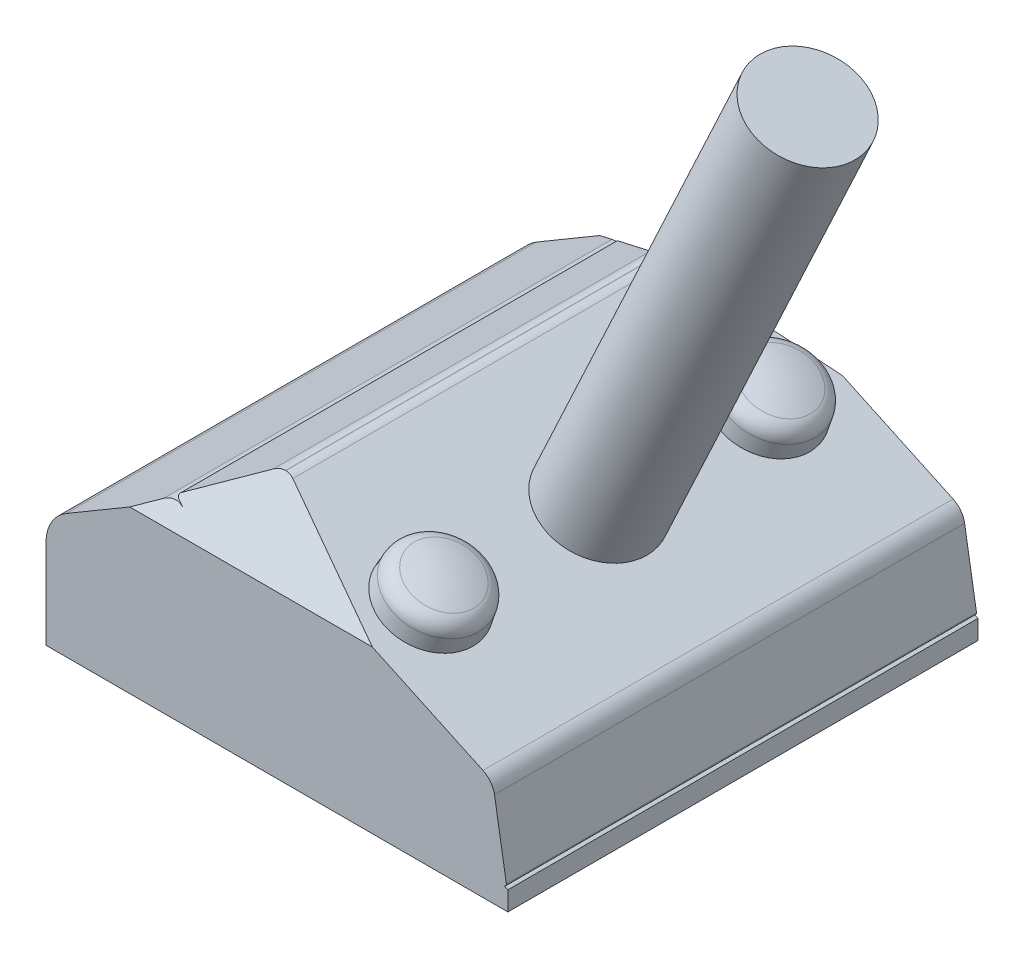
ISO-10303-21;
HEADER;
FILE_DESCRIPTION(('STEP AP214'),'2;1');
FILE_NAME('part.step','',(''),(''),'','','');
FILE_SCHEMA(('AUTOMOTIVE_DESIGN { 1 0 10303 214 1 1 1 1 }'));
ENDSEC;
DATA;
#1=APPLICATION_CONTEXT('core data for automotive mechanical design processes');
#2=APPLICATION_PROTOCOL_DEFINITION('international standard','automotive_design',2000,#1);
#3=PRODUCT_CONTEXT('',#1,'mechanical');
#4=PRODUCT('Part','Part','',(#3));
#5=PRODUCT_RELATED_PRODUCT_CATEGORY('part','',(#4));
#6=PRODUCT_DEFINITION_FORMATION('','',#4);
#7=PRODUCT_DEFINITION_CONTEXT('part definition',#1,'design');
#8=PRODUCT_DEFINITION('design','',#6,#7);
#9=PRODUCT_DEFINITION_SHAPE('','',#8);
#10=(LENGTH_UNIT() NAMED_UNIT(*) SI_UNIT(.MILLI.,.METRE.));
#11=(NAMED_UNIT(*) PLANE_ANGLE_UNIT() SI_UNIT($,.RADIAN.));
#12=(NAMED_UNIT(*) SI_UNIT($,.STERADIAN.) SOLID_ANGLE_UNIT());
#13=UNCERTAINTY_MEASURE_WITH_UNIT(LENGTH_MEASURE(1.E-05),#10,'distance_accuracy_value','');
#14=(GEOMETRIC_REPRESENTATION_CONTEXT(3) GLOBAL_UNCERTAINTY_ASSIGNED_CONTEXT((#13)) GLOBAL_UNIT_ASSIGNED_CONTEXT((#10,
#11,#12)) REPRESENTATION_CONTEXT('',''));
#15=CARTESIAN_POINT('',(0.,0.,0.));
#16=DIRECTION('',(0.,0.,1.));
#17=DIRECTION('',(1.,0.,0.));
#18=AXIS2_PLACEMENT_3D('',#15,#16,#17);
#19=CARTESIAN_POINT('',(-16.8031482844765,7.6682588072031,11.45));
#20=DIRECTION('',(0.,0.,-1.));
#21=DIRECTION('',(-1.,0.,0.));
#22=AXIS2_PLACEMENT_3D('',#19,#20,#21);
#23=CYLINDRICAL_SURFACE('',#22,0.999999999999883);
#24=CARTESIAN_POINT('',(-16.3805246756716,8.5745641008434,10.8930015420235));
#25=CARTESIAN_POINT('',(-16.5107091629722,8.6352710593258,10.8445914876377));
#26=CARTESIAN_POINT('',(-16.6492796784135,8.66825880720299,10.8182857937152));
#27=CARTESIAN_POINT('',(-16.9908686049164,8.66825880720299,10.8182857937152));
#28=CARTESIAN_POINT('',(-17.160420674815,8.61840320334181,10.8580425622092));
#29=CARTESIAN_POINT('',(-17.3106943667089,8.52988342059941,10.9286316281731));
#30=B_SPLINE_CURVE_WITH_KNOTS('',3,(#24,#25,#26,#27,#28,#29),.UNSPECIFIED.,.F.,.F.,(4,2,4),
(5.84684709434019,6.28318530717959,6.81551968798731),.UNSPECIFIED.);
#31=CARTESIAN_POINT('',(-16.380530022736,8.5745665942397,10.8929995536937));
#32=VERTEX_POINT('',#31);
#33=CARTESIAN_POINT('',(-17.310692662731,8.5298844243374,10.9286308277539));
#34=VERTEX_POINT('',#33);
#35=EDGE_CURVE('E159',#32,#34,#30,.T.);
#36=ORIENTED_EDGE('',*,*,#35,.F.);
#37=DIRECTION('',(0.,0.,-1.));
#38=VECTOR('',#37,1.);
#39=CARTESIAN_POINT('',(-16.380530022736,8.5745665942397,10.8929995536937));
#40=LINE('',#39,#38);
#41=CARTESIAN_POINT('',(-16.380530022736,8.57456659423956,-10.8929995536939));
#42=VERTEX_POINT('',#41);
#43=EDGE_CURVE('E148',#32,#42,#40,.T.);
#44=ORIENTED_EDGE('',*,*,#43,.T.);
#45=CARTESIAN_POINT('',(-17.3106943667089,8.52988342059941,-10.9286316281731));
#46=CARTESIAN_POINT('',(-17.160420674815,8.61840320334181,-10.8580425622092));
#47=CARTESIAN_POINT('',(-16.9908685082866,8.66825880720298,-10.8182857937152));
#48=CARTESIAN_POINT('',(-16.6492815491935,8.66825880720298,-10.8182857937152));
#49=CARTESIAN_POINT('',(-16.5107125923549,8.63527185326495,-10.8445908545202));
#50=CARTESIAN_POINT('',(-16.3805292801835,8.5745662479814,-10.8929998298134));
#51=B_SPLINE_CURVE_WITH_KNOTS('',3,(#45,#46,#47,#48,#49,#50),.UNSPECIFIED.,.F.,.F.,(4,2,4),
(2.60925827278207,3.14159265358979,3.57792578590447),.UNSPECIFIED.);
#52=CARTESIAN_POINT('',(-17.310692662731,8.5298844243374,-10.9286308277539));
#53=VERTEX_POINT('',#52);
#54=EDGE_CURVE('E158',#53,#42,#51,.T.);
#55=ORIENTED_EDGE('',*,*,#54,.F.);
#56=DIRECTION('',(0.,0.,-1.));
#57=VECTOR('',#56,1.);
#58=CARTESIAN_POINT('',(-17.310692662731,8.5298844243374,10.9286308277539));
#59=LINE('',#58,#57);
#60=EDGE_CURVE('E175',#34,#53,#59,.T.);
#61=ORIENTED_EDGE('',*,*,#60,.F.);
#62=EDGE_LOOP('',(#36,#44,#55,#61));
#63=FACE_BOUND('',#62,.T.);
#64=ADVANCED_FACE('F16',(#63),#23,.T.);
#65=CARTESIAN_POINT('',(50.,4.5753225075648,14.08215));
#66=DIRECTION('',(0.,0.623473037202736,0.781844851541018));
#67=DIRECTION('',(0.,-0.781844851541018,0.623473037202736));
#68=AXIS2_PLACEMENT_3D('',#65,#66,#67);
#69=PLANE('',#68);
#70=CARTESIAN_POINT('',(-13.2022961151925,10.8453999999524,9.08215000003796));
#71=CARTESIAN_POINT('',(-13.2907381551866,10.84435547337,9.08298294555071));
#72=CARTESIAN_POINT('',(-13.3748202716985,10.8322792949343,9.09261295287541));
#73=CARTESIAN_POINT('',(-13.5446273857864,10.7848079748724,9.13046840212561));
#74=CARTESIAN_POINT('',(-13.625669948461,10.7498239577392,9.1583659976301));
#75=CARTESIAN_POINT('',(-13.6989437262806,10.7065570673074,9.19286867362093));
#76=B_SPLINE_CURVE_WITH_KNOTS('',3,(#70,#71,#72,#73,#74,#75),.UNSPECIFIED.,.F.,.F.,(4,2,4),
(0.0118097459299461,0.27260088084613,0.533392015762314),.UNSPECIFIED.);
#77=CARTESIAN_POINT('',(-13.2022961111627,10.8454,9.08215));
#78=VERTEX_POINT('',#77);
#79=CARTESIAN_POINT('',(-13.698942053136,10.706558055268,9.19286788578332));
#80=VERTEX_POINT('',#79);
#81=EDGE_CURVE('E203',#78,#80,#76,.T.);
#82=ORIENTED_EDGE('',*,*,#81,.T.);
#83=DIRECTION('',(-0.797988684471836,-0.471196337581411,0.375750011183997));
#84=VECTOR('',#83,1.);
#85=CARTESIAN_POINT('',(-13.698942053136,10.706558055268,9.19286788578333));
#86=LINE('',#85,#84);
#87=CARTESIAN_POINT('',(-16.736164869737,8.9131388057854,10.6230091014592));
#88=VERTEX_POINT('',#87);
#89=EDGE_CURVE('E212',#80,#88,#86,.T.);
#90=ORIENTED_EDGE('',*,*,#89,.T.);
#91=CARTESIAN_POINT('',(-16.7361650370515,8.91313870698934,10.6230091802429));
#92=CARTESIAN_POINT('',(-16.7399679244546,8.91089316816918,10.624799858925));
#93=CARTESIAN_POINT('',(-16.7432299821262,8.90868908601383,10.6265574784744));
#94=CARTESIAN_POINT('',(-16.7725785298862,8.88574307504744,10.6448555066838));
#95=CARTESIAN_POINT('',(-16.7853193288014,8.85710505286653,10.6676925626975));
#96=CARTESIAN_POINT('',(-16.7853193288014,8.79695489448897,10.7156586033486));
#97=CARTESIAN_POINT('',(-16.7724809457357,8.76824057664243,10.7385565004489));
#98=CARTESIAN_POINT('',(-16.7405087365899,8.74324326952934,10.7584903107911));
#99=CARTESIAN_POINT('',(-16.7346714684615,8.73970551337739,10.7613114530786));
#100=CARTESIAN_POINT('',(-16.7275816896815,8.73639944431363,10.763947839206));
#101=B_SPLINE_CURVE_WITH_KNOTS('',3,(#91,#92,#93,#94,#95,#96,#97,#98,#99,#100),.UNSPECIFIED.,
.F.,.F.,(4,2,2,2,4),(0.533392015759303,0.663572278463614,1.5707963267949,2.47802037512618,
2.70525444075582),.UNSPECIFIED.);
#102=CARTESIAN_POINT('',(-16.727581154975,8.736399194974,10.763948038039));
#103=VERTEX_POINT('',#102);
#104=EDGE_CURVE('E169',#88,#103,#101,.T.);
#105=ORIENTED_EDGE('',*,*,#104,.T.);
#106=DIRECTION('',(0.858846537496951,-0.400486717614732,0.319363451327286));
#107=VECTOR('',#106,1.);
#108=CARTESIAN_POINT('',(-16.727581154975,8.73639919497399,10.763948038039));
#109=LINE('',#108,#107);
#110=EDGE_CURVE('E152',#103,#32,#109,.T.);
#111=ORIENTED_EDGE('',*,*,#110,.T.);
#112=ORIENTED_EDGE('',*,*,#35,.T.);
#113=DIRECTION('',(-0.798688501115211,-0.470470991874492,0.375171592729207));
#114=VECTOR('',#113,1.);
#115=CARTESIAN_POINT('',(-17.310692662731,8.5298844243374,10.9286308277539));
#116=LINE('',#115,#114);
#117=CARTESIAN_POINT('',(-18.4206156173974,7.87607940190746,11.45));
#118=VERTEX_POINT('',#117);
#119=EDGE_CURVE('E171',#34,#118,#116,.T.);
#120=ORIENTED_EDGE('',*,*,#119,.T.);
#121=DIRECTION('',(-1.,0.,0.));
#122=VECTOR('',#121,1.);
#123=CARTESIAN_POINT('',(-6.60091386385872,7.87607940190746,11.45));
#124=LINE('',#123,#122);
#125=CARTESIAN_POINT('',(-6.60091386385872,7.87607940190747,11.45));
#126=VERTEX_POINT('',#125);
#127=EDGE_CURVE('E240',#126,#118,#124,.T.);
#128=ORIENTED_EDGE('',*,*,#127,.F.);
#129=DIRECTION('',(-0.858846537496953,0.400486717614728,-0.319363451327286));
#130=VECTOR('',#129,1.);
#131=CARTESIAN_POINT('',(-6.60091386385872,7.87607940190747,11.45));
#132=LINE('',#131,#130);
#133=CARTESIAN_POINT('',(-12.767868382038,10.751777521228,9.15680815126285));
#134=VERTEX_POINT('',#133);
#135=EDGE_CURVE('E244',#126,#134,#132,.T.);
#136=ORIENTED_EDGE('',*,*,#135,.T.);
#137=CARTESIAN_POINT('',(-12.7678630349736,10.7517750278317,9.15681013959258));
#138=CARTESIAN_POINT('',(-12.8310005839316,10.7812170039285,9.13333197992683));
#139=CARTESIAN_POINT('',(-12.8986188017087,10.8045934677253,9.11469069213972));
#140=CARTESIAN_POINT('',(-13.0379473115213,10.836346581018,9.08936954313396));
#141=CARTESIAN_POINT('',(-13.1070988441039,10.8445546387803,9.08282412342248));
#142=CARTESIAN_POINT('',(-13.1786771723643,10.8453999999524,9.08215000003796));
#143=B_SPLINE_CURVE_WITH_KNOTS('',3,(#137,#138,#139,#140,#141,#142),.UNSPECIFIED.,.F.,.F.,(4,2,
4),(5.84684709433965,6.05911132779465,6.27137556124964),.UNSPECIFIED.);
#144=CARTESIAN_POINT('',(-13.1786771763941,10.8454,9.08215));
#145=VERTEX_POINT('',#144);
#146=EDGE_CURVE('E249',#134,#145,#143,.T.);
#147=ORIENTED_EDGE('',*,*,#146,.T.);
#148=DIRECTION('',(-1.,0.,0.));
#149=VECTOR('',#148,1.);
#150=CARTESIAN_POINT('',(-13.1786771763941,10.8454,9.08215));
#151=LINE('',#150,#149);
#152=EDGE_CURVE('E257',#145,#78,#151,.T.);
#153=ORIENTED_EDGE('',*,*,#152,.T.);
#154=EDGE_LOOP('',(#82,#90,#105,#111,#112,#120,#128,#136,#147,#153));
#155=FACE_BOUND('',#154,.T.);
#156=ADVANCED_FACE('F165',(#155),#69,.T.);
#157=CARTESIAN_POINT('',(-16.727581154975,8.736399194974,11.45));
#158=DIRECTION('',(0.422618261740698,0.906307787036651,0.));
#159=DIRECTION('',(-0.906307787036651,0.422618261740698,0.));
#160=AXIS2_PLACEMENT_3D('',#157,#158,#159);
#161=PLANE('',#160);
#162=ORIENTED_EDGE('',*,*,#110,.F.);
#163=DIRECTION('',(0.,0.,-1.));
#164=VECTOR('',#163,1.);
#165=CARTESIAN_POINT('',(-16.727581154975,8.736399194974,10.763948038039));
#166=LINE('',#165,#164);
#167=CARTESIAN_POINT('',(-16.727581154975,8.736399194974,-10.763948038039));
#168=VERTEX_POINT('',#167);
#169=EDGE_CURVE('E264',#103,#168,#166,.T.);
#170=ORIENTED_EDGE('',*,*,#169,.T.);
#171=DIRECTION('',(-0.85884653749695,0.400486717614733,0.319363451327288));
#172=VECTOR('',#171,1.);
#173=CARTESIAN_POINT('',(-16.3805300227359,8.57456659423957,-10.8929995536939));
#174=LINE('',#173,#172);
#175=EDGE_CURVE('E154',#42,#168,#174,.T.);
#176=ORIENTED_EDGE('',*,*,#175,.F.);
#177=ORIENTED_EDGE('',*,*,#43,.F.);
#178=EDGE_LOOP('',(#162,#170,#176,#177));
#179=FACE_BOUND('',#178,.T.);
#180=ADVANCED_FACE('F150',(#179),#161,.F.);
#181=CARTESIAN_POINT('',(50.,10.8454,-9.08215));
#182=DIRECTION('',(0.,0.623473037202736,-0.781844851541018));
#183=DIRECTION('',(0.,0.781844851541018,0.623473037202736));
#184=AXIS2_PLACEMENT_3D('',#181,#182,#183);
#185=PLANE('',#184);
#186=CARTESIAN_POINT('',(-13.1786771723642,10.8453999999524,-9.08215000003795));
#187=CARTESIAN_POINT('',(-13.1070997198837,10.8445546491235,-9.0828241151744));
#188=CARTESIAN_POINT('',(-13.0379489802519,10.8363467751655,-9.08936938831329));
#189=CARTESIAN_POINT('',(-12.8986220864931,10.8045944024824,-9.11468994672857));
#190=CARTESIAN_POINT('',(-12.8310046014199,10.7812184868097,-9.13333079742059));
#191=CARTESIAN_POINT('',(-12.767867639486,10.7517771749699,-9.15680842738229));
#192=B_SPLINE_CURVE_WITH_KNOTS('',3,(#186,#187,#188,#189,#190,#191),.UNSPECIFIED.,.F.,.F.,(4,2,
4),(3.15340239951982,3.36566409271214,3.57792578590446),.UNSPECIFIED.);
#193=CARTESIAN_POINT('',(-13.178677176394,10.8454,-9.08215));
#194=VERTEX_POINT('',#193);
#195=CARTESIAN_POINT('',(-12.767868382038,10.751777521228,-9.15680815126285));
#196=VERTEX_POINT('',#195);
#197=EDGE_CURVE('E271',#194,#196,#192,.T.);
#198=ORIENTED_EDGE('',*,*,#197,.T.);
#199=DIRECTION('',(0.858846537496953,-0.400486717614728,-0.319363451327286));
#200=VECTOR('',#199,1.);
#201=CARTESIAN_POINT('',(-12.767868382038,10.751777521228,-9.15680815126285));
#202=LINE('',#201,#200);
#203=CARTESIAN_POINT('',(-6.60091386385871,7.87607940190746,-11.45));
#204=VERTEX_POINT('',#203);
#205=EDGE_CURVE('E285',#196,#204,#202,.T.);
#206=ORIENTED_EDGE('',*,*,#205,.T.);
#207=DIRECTION('',(-1.,0.,0.));
#208=VECTOR('',#207,1.);
#209=CARTESIAN_POINT('',(-6.60091386385871,7.87607940190746,-11.45));
#210=LINE('',#209,#208);
#211=CARTESIAN_POINT('',(-18.4206156173974,7.87607940190746,-11.45));
#212=VERTEX_POINT('',#211);
#213=EDGE_CURVE('E392',#204,#212,#210,.T.);
#214=ORIENTED_EDGE('',*,*,#213,.T.);
#215=DIRECTION('',(0.79868850111521,0.470470991874493,0.375171592729208));
#216=VECTOR('',#215,1.);
#217=CARTESIAN_POINT('',(-18.4206156173974,7.87607940190745,-11.45));
#218=LINE('',#217,#216);
#219=EDGE_CURVE('E394',#212,#53,#218,.T.);
#220=ORIENTED_EDGE('',*,*,#219,.T.);
#221=ORIENTED_EDGE('',*,*,#54,.T.);
#222=ORIENTED_EDGE('',*,*,#175,.T.);
#223=CARTESIAN_POINT('',(-16.7275816896815,8.73639944431363,-10.763947839206));
#224=CARTESIAN_POINT('',(-16.7346714684615,8.73970551337739,-10.7613114530786));
#225=CARTESIAN_POINT('',(-16.7405087365899,8.74324326952934,-10.7584903107911));
#226=CARTESIAN_POINT('',(-16.7724809457357,8.76824057664243,-10.7385565004489));
#227=CARTESIAN_POINT('',(-16.7853193288014,8.79695489448897,-10.7156586033486));
#228=CARTESIAN_POINT('',(-16.7853193288014,8.85710505286653,-10.6676925626975));
#229=CARTESIAN_POINT('',(-16.7725785298862,8.88574307504744,-10.6448555066838));
#230=CARTESIAN_POINT('',(-16.7432299821261,8.90868908601383,-10.6265574784744));
#231=CARTESIAN_POINT('',(-16.7399679244546,8.91089316816918,-10.624799858925));
#232=CARTESIAN_POINT('',(-16.7361650370515,8.91313870698934,-10.6230091802429));
#233=B_SPLINE_CURVE_WITH_KNOTS('',3,(#223,#224,#225,#226,#227,#228,#229,#230,#231,#232),
.UNSPECIFIED.,.F.,.F.,(4,2,2,2,4),(0.436338212833969,0.663572278463614,1.5707963267949,
2.47802037512618,2.60820063783049),.UNSPECIFIED.);
#234=CARTESIAN_POINT('',(-16.736164869737,8.9131388057854,-10.6230091014592));
#235=VERTEX_POINT('',#234);
#236=EDGE_CURVE('E322',#168,#235,#233,.T.);
#237=ORIENTED_EDGE('',*,*,#236,.T.);
#238=DIRECTION('',(0.797988684471836,0.471196337581411,0.375750011183997));
#239=VECTOR('',#238,1.);
#240=CARTESIAN_POINT('',(-16.736164869737,8.91313880578539,-10.6230091014592));
#241=LINE('',#240,#239);
#242=CARTESIAN_POINT('',(-13.698942053136,10.706558055268,-9.19286788578332));
#243=VERTEX_POINT('',#242);
#244=EDGE_CURVE('E313',#235,#243,#241,.T.);
#245=ORIENTED_EDGE('',*,*,#244,.T.);
#246=CARTESIAN_POINT('',(-13.6989437262806,10.7065570673074,-9.19286867362093));
#247=CARTESIAN_POINT('',(-13.6256699484611,10.7498239577392,-9.15836599763011));
#248=CARTESIAN_POINT('',(-13.5446273857865,10.7848079748724,-9.13046840212562));
#249=CARTESIAN_POINT('',(-13.3748202716985,10.8322792949343,-9.09261295287542));
#250=CARTESIAN_POINT('',(-13.2907381551867,10.84435547337,-9.08298294555071));
#251=CARTESIAN_POINT('',(-13.2022961151926,10.8453999999524,-9.08215000003795));
#252=B_SPLINE_CURVE_WITH_KNOTS('',3,(#246,#247,#248,#249,#250,#251),.UNSPECIFIED.,.F.,.F.,(4,2,
4),(2.60820063782748,2.8689917727436,3.12978290765972),.UNSPECIFIED.);
#253=CARTESIAN_POINT('',(-13.2022961111628,10.8454,-9.08215));
#254=VERTEX_POINT('',#253);
#255=EDGE_CURVE('E321',#243,#254,#252,.T.);
#256=ORIENTED_EDGE('',*,*,#255,.T.);
#257=DIRECTION('',(-1.,0.,0.));
#258=VECTOR('',#257,1.);
#259=CARTESIAN_POINT('',(-13.178677176394,10.8454,-9.08215));
#260=LINE('',#259,#258);
#261=EDGE_CURVE('E326',#194,#254,#260,.T.);
#262=ORIENTED_EDGE('',*,*,#261,.F.);
#263=EDGE_LOOP('',(#198,#206,#214,#220,#221,#222,#237,#245,#256,#262));
#264=FACE_BOUND('',#263,.T.);
#265=ADVANCED_FACE('F287',(#264),#185,.T.);
#266=CARTESIAN_POINT('',(-17.310692662731,8.5298844243374,11.45));
#267=DIRECTION('',(0.507544378254649,-0.861625617134322,0.));
#268=DIRECTION('',(0.861625617134322,0.507544378254649,0.));
#269=AXIS2_PLACEMENT_3D('',#266,#267,#268);
#270=PLANE('',#269);
#271=ORIENTED_EDGE('',*,*,#119,.F.);
#272=ORIENTED_EDGE('',*,*,#60,.T.);
#273=ORIENTED_EDGE('',*,*,#219,.F.);
#274=DIRECTION('',(-0.861625617134323,-0.507544378254649,0.));
#275=VECTOR('',#274,1.);
#276=CARTESIAN_POINT('',(-18.4206156173974,7.87607940190746,-11.45));
#277=LINE('',#276,#275);
#278=CARTESIAN_POINT('',(-21.515088756509,6.0532663213961,-11.45));
#279=VERTEX_POINT('',#278);
#280=EDGE_CURVE('E332',#212,#279,#277,.T.);
#281=ORIENTED_EDGE('',*,*,#280,.T.);
#282=DIRECTION('',(0.,0.,-1.));
#283=VECTOR('',#282,1.);
#284=CARTESIAN_POINT('',(-21.515088756509,6.0532663213961,11.45));
#285=LINE('',#284,#283);
#286=CARTESIAN_POINT('',(-21.515088756509,6.0532663213961,11.45));
#287=VERTEX_POINT('',#286);
#288=EDGE_CURVE('E335',#287,#279,#285,.T.);
#289=ORIENTED_EDGE('',*,*,#288,.F.);
#290=DIRECTION('',(-0.861625617134323,-0.507544378254649,0.));
#291=VECTOR('',#290,1.);
#292=CARTESIAN_POINT('',(-18.4206156173974,7.87607940190746,11.45));
#293=LINE('',#292,#291);
#294=EDGE_CURVE('E343',#118,#287,#293,.T.);
#295=ORIENTED_EDGE('',*,*,#294,.F.);
#296=EDGE_LOOP('',(#271,#272,#273,#281,#289,#295));
#297=FACE_BOUND('',#296,.T.);
#298=ADVANCED_FACE('F296',(#297),#270,.F.);
#299=CARTESIAN_POINT('',(-13.1904866437784,9.84546973419298,11.45));
#300=DIRECTION('',(0.,0.,-1.));
#301=DIRECTION('',(-1.,0.,0.));
#302=AXIS2_PLACEMENT_3D('',#299,#300,#301);
#303=CYLINDRICAL_SURFACE('',#302,0.999999999998396);
#304=ORIENTED_EDGE('',*,*,#81,.F.);
#305=DIRECTION('',(0.,0.,1.));
#306=VECTOR('',#305,1.);
#307=CARTESIAN_POINT('',(-13.2022961111627,10.8454,-9.08215));
#308=LINE('',#307,#306);
#309=EDGE_CURVE('E348',#254,#78,#308,.T.);
#310=ORIENTED_EDGE('',*,*,#309,.F.);
#311=ORIENTED_EDGE('',*,*,#255,.F.);
#312=DIRECTION('',(0.,0.,-1.));
#313=VECTOR('',#312,1.);
#314=CARTESIAN_POINT('',(-13.698942053136,10.706558055268,9.19286788578332));
#315=LINE('',#314,#313);
#316=EDGE_CURVE('E432',#80,#243,#315,.T.);
#317=ORIENTED_EDGE('',*,*,#316,.F.);
#318=EDGE_LOOP('',(#304,#310,#311,#317));
#319=FACE_BOUND('',#318,.T.);
#320=ADVANCED_FACE('F356',(#319),#303,.T.);
#321=CARTESIAN_POINT('',(-13.698942053136,10.706558055268,11.45));
#322=DIRECTION('',(0.508455409357312,-0.861088321077047,0.));
#323=DIRECTION('',(0.861088321077047,0.508455409357312,0.));
#324=AXIS2_PLACEMENT_3D('',#321,#322,#323);
#325=PLANE('',#324);
#326=ORIENTED_EDGE('',*,*,#89,.F.);
#327=ORIENTED_EDGE('',*,*,#316,.T.);
#328=ORIENTED_EDGE('',*,*,#244,.F.);
#329=DIRECTION('',(0.,0.,-1.));
#330=VECTOR('',#329,1.);
#331=CARTESIAN_POINT('',(-16.736164869737,8.9131388057854,10.6230091014592));
#332=LINE('',#331,#330);
#333=EDGE_CURVE('E428',#88,#235,#332,.T.);
#334=ORIENTED_EDGE('',*,*,#333,.F.);
#335=EDGE_LOOP('',(#326,#327,#328,#334));
#336=FACE_BOUND('',#335,.T.);
#337=ADVANCED_FACE('F365',(#336),#325,.F.);
#338=CARTESIAN_POINT('',(-16.6853193288015,8.82702997367775,11.45));
#339=DIRECTION('',(0.,0.,-1.));
#340=DIRECTION('',(-1.,0.,0.));
#341=AXIS2_PLACEMENT_3D('',#338,#339,#340);
#342=CYLINDRICAL_SURFACE('',#341,0.0999999999998359);
#343=ORIENTED_EDGE('',*,*,#104,.F.);
#344=ORIENTED_EDGE('',*,*,#333,.T.);
#345=ORIENTED_EDGE('',*,*,#236,.F.);
#346=ORIENTED_EDGE('',*,*,#169,.F.);
#347=EDGE_LOOP('',(#343,#344,#345,#346));
#348=FACE_BOUND('',#347,.T.);
#349=ADVANCED_FACE('F782',(#348),#342,.T.);
#350=CARTESIAN_POINT('',(-20.4999999999982,4.33001508712628,11.45));
#351=DIRECTION('',(0.,0.,1.));
#352=DIRECTION('',(1.,0.,0.));
#353=AXIS2_PLACEMENT_3D('',#350,#351,#352);
#354=PLANE('',#353);
#355=DIRECTION('',(-0.906307787036652,0.422618261740695,0.));
#356=VECTOR('',#355,1.);
#357=CARTESIAN_POINT('',(-1.2156848718635,5.3649058820218,11.45));
#358=LINE('',#357,#356);
#359=CARTESIAN_POINT('',(-1.2156848718635,5.3649058820218,11.45));
#360=VERTEX_POINT('',#359);
#361=EDGE_CURVE('E422',#360,#126,#358,.T.);
#362=ORIENTED_EDGE('',*,*,#361,.T.);
#363=ORIENTED_EDGE('',*,*,#127,.T.);
#364=ORIENTED_EDGE('',*,*,#294,.T.);
#365=CARTESIAN_POINT('',(-20.4999999999982,4.33001508712628,11.45));
#366=DIRECTION('',(0.,0.,1.));
#367=DIRECTION('',(-0.50754437825493,0.861625617134157,0.));
#368=AXIS2_PLACEMENT_3D('',#365,#366,#367);
#369=CIRCLE('',#368,2.00000000000177);
#370=CARTESIAN_POINT('',(-22.5,4.3300150871275,11.45));
#371=VERTEX_POINT('',#370);
#372=EDGE_CURVE('E427',#287,#371,#369,.T.);
#373=ORIENTED_EDGE('',*,*,#372,.T.);
#374=DIRECTION('',(0.,-1.,0.));
#375=VECTOR('',#374,1.);
#376=CARTESIAN_POINT('',(-22.5,4.3300150871275,11.45));
#377=LINE('',#376,#375);
#378=CARTESIAN_POINT('',(-22.5,0.,11.45));
#379=VERTEX_POINT('',#378);
#380=EDGE_CURVE('E430',#371,#379,#377,.T.);
#381=ORIENTED_EDGE('',*,*,#380,.T.);
#382=DIRECTION('',(1.,0.,0.));
#383=VECTOR('',#382,1.);
#384=CARTESIAN_POINT('',(-22.5,0.,11.45));
#385=LINE('',#384,#383);
#386=CARTESIAN_POINT('',(0.,0.,11.45));
#387=VERTEX_POINT('',#386);
#388=EDGE_CURVE('E445',#379,#387,#385,.T.);
#389=ORIENTED_EDGE('',*,*,#388,.T.);
#390=DIRECTION('',(0.,1.,0.));
#391=VECTOR('',#390,1.);
#392=CARTESIAN_POINT('',(0.,0.,11.45));
#393=LINE('',#392,#391);
#394=CARTESIAN_POINT('',(0.,0.9362,11.45));
#395=VERTEX_POINT('',#394);
#396=EDGE_CURVE('E450',#387,#395,#393,.T.);
#397=ORIENTED_EDGE('',*,*,#396,.T.);
#398=DIRECTION('',(-0.906307787036649,0.422618261740701,0.));
#399=VECTOR('',#398,1.);
#400=CARTESIAN_POINT('',(0.,0.9362,11.45));
#401=LINE('',#400,#399);
#402=CARTESIAN_POINT('',(-0.21429993111127,1.03612969901927,11.45));
#403=VERTEX_POINT('',#402);
#404=EDGE_CURVE('E455',#395,#403,#401,.T.);
#405=ORIENTED_EDGE('',*,*,#404,.T.);
#406=CARTESIAN_POINT('',(-0.172038104937197,1.12676047772294,11.45));
#407=DIRECTION('',(0.,0.,1.));
#408=DIRECTION('',(-0.422618261740702,-0.906307787036649,0.));
#409=AXIS2_PLACEMENT_3D('',#406,#407,#408);
#410=CIRCLE('',#409,0.100000000000048);
#411=CARTESIAN_POINT('',(-0.073392028876268,1.1431602239951,11.45));
#412=VERTEX_POINT('',#411);
#413=EDGE_CURVE('E460',#403,#412,#410,.T.);
#414=ORIENTED_EDGE('',*,*,#413,.T.);
#415=DIRECTION('',(-0.163997462722036,0.98646076060872,0.));
#416=VECTOR('',#415,1.);
#417=CARTESIAN_POINT('',(-0.073392028876268,1.1431602239951,11.45));
#418=LINE('',#417,#416);
#419=CARTESIAN_POINT('',(-0.65184237299545,4.6225955577072,11.45));
#420=VERTEX_POINT('',#419);
#421=EDGE_CURVE('E465',#412,#420,#418,.T.);
#422=ORIENTED_EDGE('',*,*,#421,.T.);
#423=CARTESIAN_POINT('',(-1.63830313360404,4.45859809498523,11.45));
#424=DIRECTION('',(0.,0.,1.));
#425=DIRECTION('',(0.986460760608727,0.163997462721993,0.));
#426=AXIS2_PLACEMENT_3D('',#423,#424,#425);
#427=CIRCLE('',#426,0.999999999999861);
#428=EDGE_CURVE('E424',#420,#360,#427,.T.);
#429=ORIENTED_EDGE('',*,*,#428,.T.);
#430=EDGE_LOOP('',(#362,#363,#364,#373,#381,#389,#397,#405,#414,#422,#429));
#431=FACE_BOUND('',#430,.T.);
#432=ADVANCED_FACE('F418',(#431),#354,.T.);
#433=CARTESIAN_POINT('',(-1.2156848718635,5.3649058820218,11.45));
#434=DIRECTION('',(-0.422618261740695,-0.906307787036652,0.));
#435=DIRECTION('',(0.906307787036652,-0.422618261740695,0.));
#436=AXIS2_PLACEMENT_3D('',#433,#434,#435);
#437=PLANE('',#436);
#438=CARTESIAN_POINT('',(-6.99181815500177,8.0583610664731,0.));
#439=DIRECTION('',(0.422618261740694,0.906307787036652,0.));
#440=DIRECTION('',(0.906307787036652,-0.422618261740694,0.));
#441=AXIS2_PLACEMENT_3D('',#438,#439,#440);
#442=CIRCLE('',#441,2.54999999999982);
#443=CARTESIAN_POINT('',(-4.68073329805847,6.98068449903441,0.));
#444=VERTEX_POINT('',#443);
#445=EDGE_CURVE('E472',#444,#444,#442,.T.);
#446=ORIENTED_EDGE('',*,*,#445,.F.);
#447=EDGE_LOOP('',(#446));
#448=FACE_BOUND('',#447,.T.);
#449=CARTESIAN_POINT('',(-6.99181815500171,8.05836106647322,-8.2));
#450=DIRECTION('',(0.422618261740712,0.906307787036644,0.));
#451=DIRECTION('',(0.906307787036644,-0.422618261740712,0.));
#452=AXIS2_PLACEMENT_3D('',#449,#450,#451);
#453=CIRCLE('',#452,2.25000375837241);
#454=CARTESIAN_POINT('',(-4.95262222792708,7.1074683891998,-8.2));
#455=VERTEX_POINT('',#454);
#456=EDGE_CURVE('E477',#455,#455,#453,.T.);
#457=ORIENTED_EDGE('',*,*,#456,.F.);
#458=EDGE_LOOP('',(#457));
#459=FACE_BOUND('',#458,.T.);
#460=CARTESIAN_POINT('',(-6.99181815500171,8.05836106647322,8.2));
#461=DIRECTION('',(0.422618261740712,0.906307787036644,0.));
#462=DIRECTION('',(0.906307787036644,-0.422618261740712,0.));
#463=AXIS2_PLACEMENT_3D('',#460,#461,#462);
#464=CIRCLE('',#463,2.25000375837241);
#465=CARTESIAN_POINT('',(-4.95262222792708,7.1074683891998,8.2));
#466=VERTEX_POINT('',#465);
#467=EDGE_CURVE('E480',#466,#466,#464,.T.);
#468=ORIENTED_EDGE('',*,*,#467,.F.);
#469=EDGE_LOOP('',(#468));
#470=FACE_BOUND('',#469,.T.);
#471=ORIENTED_EDGE('',*,*,#135,.F.);
#472=ORIENTED_EDGE('',*,*,#361,.F.);
#473=DIRECTION('',(0.,0.,-1.));
#474=VECTOR('',#473,1.);
#475=CARTESIAN_POINT('',(-1.2156848718635,5.3649058820218,11.45));
#476=LINE('',#475,#474);
#477=CARTESIAN_POINT('',(-1.2156848718635,5.3649058820218,-11.45));
#478=VERTEX_POINT('',#477);
#479=EDGE_CURVE('E483',#360,#478,#476,.T.);
#480=ORIENTED_EDGE('',*,*,#479,.T.);
#481=DIRECTION('',(-0.906307787036652,0.422618261740695,0.));
#482=VECTOR('',#481,1.);
#483=CARTESIAN_POINT('',(-1.2156848718635,5.3649058820218,-11.45));
#484=LINE('',#483,#482);
#485=EDGE_CURVE('E485',#478,#204,#484,.T.);
#486=ORIENTED_EDGE('',*,*,#485,.T.);
#487=ORIENTED_EDGE('',*,*,#205,.F.);
#488=DIRECTION('',(0.,0.,-1.));
#489=VECTOR('',#488,1.);
#490=CARTESIAN_POINT('',(-12.767868382038,10.751777521228,9.15680815126285));
#491=LINE('',#490,#489);
#492=EDGE_CURVE('E391',#134,#196,#491,.T.);
#493=ORIENTED_EDGE('',*,*,#492,.F.);
#494=EDGE_LOOP('',(#471,#472,#480,#486,#487,#493));
#495=FACE_BOUND('',#494,.T.);
#496=ADVANCED_FACE('F765',(#448,#459,#470,#495),#437,.F.);
#497=ORIENTED_EDGE('',*,*,#146,.F.);
#498=ORIENTED_EDGE('',*,*,#492,.T.);
#499=ORIENTED_EDGE('',*,*,#197,.F.);
#500=DIRECTION('',(0.,0.,-1.));
#501=VECTOR('',#500,1.);
#502=CARTESIAN_POINT('',(-13.1786771763941,10.8454,9.08215));
#503=LINE('',#502,#501);
#504=EDGE_CURVE('E389',#145,#194,#503,.T.);
#505=ORIENTED_EDGE('',*,*,#504,.F.);
#506=EDGE_LOOP('',(#497,#498,#499,#505));
#507=FACE_BOUND('',#506,.T.);
#508=ADVANCED_FACE('F366',(#507),#303,.T.);
#509=CARTESIAN_POINT('',(50.,10.8454,9.08215));
#510=DIRECTION('',(0.,1.,0.));
#511=DIRECTION('',(0.,0.,1.));
#512=AXIS2_PLACEMENT_3D('',#509,#510,#511);
#513=PLANE('',#512);
#514=ORIENTED_EDGE('',*,*,#504,.T.);
#515=ORIENTED_EDGE('',*,*,#261,.T.);
#516=ORIENTED_EDGE('',*,*,#309,.T.);
#517=ORIENTED_EDGE('',*,*,#152,.F.);
#518=EDGE_LOOP('',(#514,#515,#516,#517));
#519=FACE_BOUND('',#518,.T.);
#520=ADVANCED_FACE('F747',(#519),#513,.T.);
#521=CARTESIAN_POINT('',(-20.4999999999982,4.33001508712628,-11.45));
#522=DIRECTION('',(0.,0.,1.));
#523=DIRECTION('',(1.,0.,0.));
#524=AXIS2_PLACEMENT_3D('',#521,#522,#523);
#525=PLANE('',#524);
#526=ORIENTED_EDGE('',*,*,#213,.F.);
#527=ORIENTED_EDGE('',*,*,#485,.F.);
#528=CARTESIAN_POINT('',(-1.63830313360404,4.45859809498523,-11.45));
#529=DIRECTION('',(0.,0.,1.));
#530=DIRECTION('',(0.986460760608727,0.163997462721993,0.));
#531=AXIS2_PLACEMENT_3D('',#528,#529,#530);
#532=CIRCLE('',#531,0.999999999999861);
#533=CARTESIAN_POINT('',(-0.65184237299545,4.6225955577072,-11.45));
#534=VERTEX_POINT('',#533);
#535=EDGE_CURVE('E493',#534,#478,#532,.T.);
#536=ORIENTED_EDGE('',*,*,#535,.F.);
#537=DIRECTION('',(-0.163997462722036,0.98646076060872,0.));
#538=VECTOR('',#537,1.);
#539=CARTESIAN_POINT('',(-0.073392028876268,1.1431602239951,-11.45));
#540=LINE('',#539,#538);
#541=CARTESIAN_POINT('',(-0.073392028876268,1.1431602239951,-11.45));
#542=VERTEX_POINT('',#541);
#543=EDGE_CURVE('E494',#542,#534,#540,.T.);
#544=ORIENTED_EDGE('',*,*,#543,.F.);
#545=CARTESIAN_POINT('',(-0.172038104937197,1.12676047772294,-11.45));
#546=DIRECTION('',(0.,0.,1.));
#547=DIRECTION('',(-0.422618261740702,-0.906307787036649,0.));
#548=AXIS2_PLACEMENT_3D('',#545,#546,#547);
#549=CIRCLE('',#548,0.100000000000048);
#550=CARTESIAN_POINT('',(-0.21429993111127,1.03612969901927,-11.45));
#551=VERTEX_POINT('',#550);
#552=EDGE_CURVE('E503',#551,#542,#549,.T.);
#553=ORIENTED_EDGE('',*,*,#552,.F.);
#554=DIRECTION('',(-0.906307787036649,0.422618261740701,0.));
#555=VECTOR('',#554,1.);
#556=CARTESIAN_POINT('',(0.,0.9362,-11.45));
#557=LINE('',#556,#555);
#558=CARTESIAN_POINT('',(0.,0.9362,-11.45));
#559=VERTEX_POINT('',#558);
#560=EDGE_CURVE('E508',#559,#551,#557,.T.);
#561=ORIENTED_EDGE('',*,*,#560,.F.);
#562=DIRECTION('',(0.,1.,0.));
#563=VECTOR('',#562,1.);
#564=CARTESIAN_POINT('',(0.,0.,-11.45));
#565=LINE('',#564,#563);
#566=CARTESIAN_POINT('',(0.,0.,-11.45));
#567=VERTEX_POINT('',#566);
#568=EDGE_CURVE('E513',#567,#559,#565,.T.);
#569=ORIENTED_EDGE('',*,*,#568,.F.);
#570=DIRECTION('',(1.,0.,0.));
#571=VECTOR('',#570,1.);
#572=CARTESIAN_POINT('',(-22.5,0.,-11.45));
#573=LINE('',#572,#571);
#574=CARTESIAN_POINT('',(-22.5,0.,-11.45));
#575=VERTEX_POINT('',#574);
#576=EDGE_CURVE('E518',#575,#567,#573,.T.);
#577=ORIENTED_EDGE('',*,*,#576,.F.);
#578=DIRECTION('',(0.,-1.,0.));
#579=VECTOR('',#578,1.);
#580=CARTESIAN_POINT('',(-22.5,4.3300150871275,-11.45));
#581=LINE('',#580,#579);
#582=CARTESIAN_POINT('',(-22.5,4.3300150871275,-11.45));
#583=VERTEX_POINT('',#582);
#584=EDGE_CURVE('E523',#583,#575,#581,.T.);
#585=ORIENTED_EDGE('',*,*,#584,.F.);
#586=CARTESIAN_POINT('',(-20.4999999999982,4.33001508712628,-11.45));
#587=DIRECTION('',(0.,0.,1.));
#588=DIRECTION('',(-0.50754437825493,0.861625617134157,0.));
#589=AXIS2_PLACEMENT_3D('',#586,#587,#588);
#590=CIRCLE('',#589,2.00000000000177);
#591=EDGE_CURVE('E528',#279,#583,#590,.T.);
#592=ORIENTED_EDGE('',*,*,#591,.F.);
#593=ORIENTED_EDGE('',*,*,#280,.F.);
#594=EDGE_LOOP('',(#526,#527,#536,#544,#553,#561,#569,#577,#585,#592,#593));
#595=FACE_BOUND('',#594,.T.);
#596=ADVANCED_FACE('F737',(#595),#525,.F.);
#597=CARTESIAN_POINT('',(-20.4999999999982,4.33001508712628,11.45));
#598=DIRECTION('',(0.,0.,-1.));
#599=DIRECTION('',(-1.,0.,0.));
#600=AXIS2_PLACEMENT_3D('',#597,#598,#599);
#601=CYLINDRICAL_SURFACE('',#600,2.00000000000177);
#602=ORIENTED_EDGE('',*,*,#591,.T.);
#603=DIRECTION('',(0.,0.,-1.));
#604=VECTOR('',#603,1.);
#605=CARTESIAN_POINT('',(-22.5,4.3300150871275,11.45));
#606=LINE('',#605,#604);
#607=EDGE_CURVE('E533',#371,#583,#606,.T.);
#608=ORIENTED_EDGE('',*,*,#607,.F.);
#609=ORIENTED_EDGE('',*,*,#372,.F.);
#610=ORIENTED_EDGE('',*,*,#288,.T.);
#611=EDGE_LOOP('',(#602,#608,#609,#610));
#612=FACE_BOUND('',#611,.T.);
#613=ADVANCED_FACE('F727',(#612),#601,.T.);
#614=CARTESIAN_POINT('',(-22.5,4.3300150871275,11.45));
#615=DIRECTION('',(1.,0.,0.));
#616=DIRECTION('',(0.,0.,-1.));
#617=AXIS2_PLACEMENT_3D('',#614,#615,#616);
#618=PLANE('',#617);
#619=ORIENTED_EDGE('',*,*,#584,.T.);
#620=DIRECTION('',(0.,0.,-1.));
#621=VECTOR('',#620,1.);
#622=CARTESIAN_POINT('',(-22.5,0.,11.45));
#623=LINE('',#622,#621);
#624=EDGE_CURVE('E537',#379,#575,#623,.T.);
#625=ORIENTED_EDGE('',*,*,#624,.F.);
#626=ORIENTED_EDGE('',*,*,#380,.F.);
#627=ORIENTED_EDGE('',*,*,#607,.T.);
#628=EDGE_LOOP('',(#619,#625,#626,#627));
#629=FACE_BOUND('',#628,.T.);
#630=ADVANCED_FACE('F717',(#629),#618,.F.);
#631=CARTESIAN_POINT('',(-22.5,0.,11.45));
#632=DIRECTION('',(0.,1.,0.));
#633=DIRECTION('',(0.,0.,1.));
#634=AXIS2_PLACEMENT_3D('',#631,#632,#633);
#635=PLANE('',#634);
#636=ORIENTED_EDGE('',*,*,#576,.T.);
#637=DIRECTION('',(0.,0.,-1.));
#638=VECTOR('',#637,1.);
#639=CARTESIAN_POINT('',(0.,0.,11.45));
#640=LINE('',#639,#638);
#641=EDGE_CURVE('E541',#387,#567,#640,.T.);
#642=ORIENTED_EDGE('',*,*,#641,.F.);
#643=ORIENTED_EDGE('',*,*,#388,.F.);
#644=ORIENTED_EDGE('',*,*,#624,.T.);
#645=EDGE_LOOP('',(#636,#642,#643,#644));
#646=FACE_BOUND('',#645,.T.);
#647=ADVANCED_FACE('F707',(#646),#635,.F.);
#648=CARTESIAN_POINT('',(0.,0.,11.45));
#649=DIRECTION('',(-1.,0.,0.));
#650=DIRECTION('',(0.,0.,1.));
#651=AXIS2_PLACEMENT_3D('',#648,#649,#650);
#652=PLANE('',#651);
#653=ORIENTED_EDGE('',*,*,#568,.T.);
#654=DIRECTION('',(0.,0.,-1.));
#655=VECTOR('',#654,1.);
#656=CARTESIAN_POINT('',(0.,0.9362,11.45));
#657=LINE('',#656,#655);
#658=EDGE_CURVE('E545',#395,#559,#657,.T.);
#659=ORIENTED_EDGE('',*,*,#658,.F.);
#660=ORIENTED_EDGE('',*,*,#396,.F.);
#661=ORIENTED_EDGE('',*,*,#641,.T.);
#662=EDGE_LOOP('',(#653,#659,#660,#661));
#663=FACE_BOUND('',#662,.T.);
#664=ADVANCED_FACE('F697',(#663),#652,.F.);
#665=CARTESIAN_POINT('',(0.,0.9362,11.45));
#666=DIRECTION('',(-0.422618261740701,-0.906307787036649,0.));
#667=DIRECTION('',(0.906307787036649,-0.422618261740701,0.));
#668=AXIS2_PLACEMENT_3D('',#665,#666,#667);
#669=PLANE('',#668);
#670=ORIENTED_EDGE('',*,*,#560,.T.);
#671=DIRECTION('',(0.,0.,-1.));
#672=VECTOR('',#671,1.);
#673=CARTESIAN_POINT('',(-0.21429993111121,1.0361296990192,11.45));
#674=LINE('',#673,#672);
#675=EDGE_CURVE('E549',#403,#551,#674,.T.);
#676=ORIENTED_EDGE('',*,*,#675,.F.);
#677=ORIENTED_EDGE('',*,*,#404,.F.);
#678=ORIENTED_EDGE('',*,*,#658,.T.);
#679=EDGE_LOOP('',(#670,#676,#677,#678));
#680=FACE_BOUND('',#679,.T.);
#681=ADVANCED_FACE('F687',(#680),#669,.F.);
#682=CARTESIAN_POINT('',(-0.172038104937197,1.12676047772294,11.45));
#683=DIRECTION('',(0.,0.,-1.));
#684=DIRECTION('',(-1.,0.,0.));
#685=AXIS2_PLACEMENT_3D('',#682,#683,#684);
#686=CYLINDRICAL_SURFACE('',#685,0.100000000000048);
#687=ORIENTED_EDGE('',*,*,#552,.T.);
#688=DIRECTION('',(0.,0.,-1.));
#689=VECTOR('',#688,1.);
#690=CARTESIAN_POINT('',(-0.073392028876268,1.1431602239951,11.45));
#691=LINE('',#690,#689);
#692=EDGE_CURVE('E553',#412,#542,#691,.T.);
#693=ORIENTED_EDGE('',*,*,#692,.F.);
#694=ORIENTED_EDGE('',*,*,#413,.F.);
#695=ORIENTED_EDGE('',*,*,#675,.T.);
#696=EDGE_LOOP('',(#687,#693,#694,#695));
#697=FACE_BOUND('',#696,.T.);
#698=ADVANCED_FACE('F677',(#697),#686,.T.);
#699=CARTESIAN_POINT('',(-0.073392028876268,1.1431602239951,11.45));
#700=DIRECTION('',(-0.98646076060872,-0.163997462722036,0.));
#701=DIRECTION('',(0.163997462722036,-0.98646076060872,0.));
#702=AXIS2_PLACEMENT_3D('',#699,#700,#701);
#703=PLANE('',#702);
#704=ORIENTED_EDGE('',*,*,#543,.T.);
#705=DIRECTION('',(0.,0.,-1.));
#706=VECTOR('',#705,1.);
#707=CARTESIAN_POINT('',(-0.65184237299545,4.6225955577072,11.45));
#708=LINE('',#707,#706);
#709=EDGE_CURVE('E557',#420,#534,#708,.T.);
#710=ORIENTED_EDGE('',*,*,#709,.F.);
#711=ORIENTED_EDGE('',*,*,#421,.F.);
#712=ORIENTED_EDGE('',*,*,#692,.T.);
#713=EDGE_LOOP('',(#704,#710,#711,#712));
#714=FACE_BOUND('',#713,.T.);
#715=ADVANCED_FACE('F667',(#714),#703,.F.);
#716=CARTESIAN_POINT('',(-1.63830313360404,4.45859809498523,11.45));
#717=DIRECTION('',(0.,0.,-1.));
#718=DIRECTION('',(-1.,0.,0.));
#719=AXIS2_PLACEMENT_3D('',#716,#717,#718);
#720=CYLINDRICAL_SURFACE('',#719,0.999999999999861);
#721=ORIENTED_EDGE('',*,*,#535,.T.);
#722=ORIENTED_EDGE('',*,*,#479,.F.);
#723=ORIENTED_EDGE('',*,*,#428,.F.);
#724=ORIENTED_EDGE('',*,*,#709,.T.);
#725=EDGE_LOOP('',(#721,#722,#723,#724));
#726=FACE_BOUND('',#725,.T.);
#727=ADVANCED_FACE('F657',(#726),#720,.T.);
#728=CARTESIAN_POINT('',(3.1510382817768,29.80978688888,0.));
#729=DIRECTION('',(0.422618261740694,0.906307787036652,0.));
#730=DIRECTION('',(-0.906307787036652,0.422618261740694,0.));
#731=AXIS2_PLACEMENT_3D('',#728,#729,#730);
#732=CYLINDRICAL_SURFACE('',#731,2.54999999999982);
#733=CARTESIAN_POINT('',(3.15103828177665,29.8097868888797,0.));
#734=DIRECTION('',(0.422618261740694,0.906307787036652,0.));
#735=DIRECTION('',(-0.906307787036652,0.422618261740694,0.));
#736=AXIS2_PLACEMENT_3D('',#733,#734,#735);
#737=CIRCLE('',#736,2.54999999999982);
#738=CARTESIAN_POINT('',(0.83995342483335,30.8874634563184,0.));
#739=VERTEX_POINT('',#738);
#740=EDGE_CURVE('E561',#739,#739,#737,.T.);
#741=ORIENTED_EDGE('',*,*,#740,.F.);
#742=EDGE_LOOP('',(#741));
#743=FACE_BOUND('',#742,.T.);
#744=ORIENTED_EDGE('',*,*,#445,.T.);
#745=EDGE_LOOP('',(#744));
#746=FACE_BOUND('',#745,.T.);
#747=ADVANCED_FACE('F647',(#743,#746),#732,.T.);
#748=CARTESIAN_POINT('',(-7.03406182617411,7.96776922129629,-8.2));
#749=DIRECTION('',(-0.422618261740712,-0.906307787036644,0.));
#750=DIRECTION('',(0.906307787036644,-0.422618261740712,0.));
#751=AXIS2_PLACEMENT_3D('',#748,#749,#750);
#752=CONICAL_SURFACE('',#751,2.25874886635253,0.0872664625996081);
#753=CARTESIAN_POINT('',(-6.66134636445801,8.76706010832734,-8.2));
#754=DIRECTION('',(0.422618261740712,0.906307787036644,0.));
#755=DIRECTION('',(-0.906307787036644,0.422618261740712,0.));
#756=AXIS2_PLACEMENT_3D('',#753,#754,#755);
#757=CIRCLE('',#756,2.18159087160182);
#758=CARTESIAN_POINT('',(-8.6385391595188,9.68904025031311,-8.2));
#759=VERTEX_POINT('',#758);
#760=EDGE_CURVE('E566',#759,#759,#757,.T.);
#761=ORIENTED_EDGE('',*,*,#760,.F.);
#762=EDGE_LOOP('',(#761));
#763=FACE_BOUND('',#762,.T.);
#764=ORIENTED_EDGE('',*,*,#456,.T.);
#765=EDGE_LOOP('',(#764));
#766=FACE_BOUND('',#765,.T.);
#767=ADVANCED_FACE('F638',(#763,#766),#752,.T.);
#768=CARTESIAN_POINT('',(-7.03406182617411,7.96776922129629,8.2));
#769=DIRECTION('',(-0.422618261740712,-0.906307787036644,0.));
#770=DIRECTION('',(0.906307787036644,-0.422618261740712,0.));
#771=AXIS2_PLACEMENT_3D('',#768,#769,#770);
#772=CONICAL_SURFACE('',#771,2.25874886635253,0.0872664625996081);
#773=CARTESIAN_POINT('',(-6.66134636445801,8.76706010832734,8.2));
#774=DIRECTION('',(0.422618261740712,0.906307787036644,0.));
#775=DIRECTION('',(-0.906307787036644,0.422618261740712,0.));
#776=AXIS2_PLACEMENT_3D('',#773,#774,#775);
#777=CIRCLE('',#776,2.18159087160182);
#778=CARTESIAN_POINT('',(-8.6385391595188,9.68904025031311,8.2));
#779=VERTEX_POINT('',#778);
#780=EDGE_CURVE('E569',#779,#779,#777,.T.);
#781=ORIENTED_EDGE('',*,*,#780,.F.);
#782=EDGE_LOOP('',(#781));
#783=FACE_BOUND('',#782,.T.);
#784=ORIENTED_EDGE('',*,*,#467,.T.);
#785=EDGE_LOOP('',(#784));
#786=FACE_BOUND('',#785,.T.);
#787=ADVANCED_FACE('F589',(#783,#786),#772,.T.);
#788=CARTESIAN_POINT('',(0.839953424833478,30.8874634563183,0.));
#789=DIRECTION('',(-0.422618261740694,-0.906307787036652,0.));
#790=DIRECTION('',(0.906307787036652,-0.422618261740694,0.));
#791=AXIS2_PLACEMENT_3D('',#788,#789,#790);
#792=PLANE('',#791);
#793=ORIENTED_EDGE('',*,*,#740,.T.);
#794=EDGE_LOOP('',(#793));
#795=FACE_BOUND('',#794,.T.);
#796=ADVANCED_FACE('F579',(#795),#792,.F.);
#797=CARTESIAN_POINT('',(-6.69081325125938,8.70386816565593,-8.2));
#798=DIRECTION('',(0.422618261740712,0.906307787036644,0.));
#799=DIRECTION('',(-0.906307787036644,0.422618261740712,0.));
#800=AXIS2_PLACEMENT_3D('',#797,#798,#799);
#801=TOROIDAL_SURFACE('',#800,1.38463511312583,0.800000000002739);
#802=ORIENTED_EDGE('',*,*,#760,.T.);
#803=EDGE_LOOP('',(#802));
#804=FACE_BOUND('',#803,.T.);
#805=CARTESIAN_POINT('',(-6.36492646729836,9.40273462916292,-8.2));
#806=DIRECTION('',(0.422618261740712,0.906307787036644,0.));
#807=DIRECTION('',(-0.906307787036644,0.422618261740712,0.));
#808=AXIS2_PLACEMENT_3D('',#805,#806,#807);
#809=CIRCLE('',#808,1.59766907809189);
#810=CARTESIAN_POINT('',(-7.8129063938807,10.077938757783,-8.2));
#811=VERTEX_POINT('',#810);
#812=EDGE_CURVE('E24',#811,#811,#809,.T.);
#813=ORIENTED_EDGE('',*,*,#812,.F.);
#814=EDGE_LOOP('',(#813));
#815=FACE_BOUND('',#814,.T.);
#816=ADVANCED_FACE('F576',(#804,#815),#801,.T.);
#817=CARTESIAN_POINT('',(-6.69081325125938,8.70386816565593,8.2));
#818=DIRECTION('',(0.422618261740712,0.906307787036644,0.));
#819=DIRECTION('',(-0.906307787036644,0.422618261740712,0.));
#820=AXIS2_PLACEMENT_3D('',#817,#818,#819);
#821=TOROIDAL_SURFACE('',#820,1.38463511312583,0.800000000002739);
#822=ORIENTED_EDGE('',*,*,#780,.T.);
#823=EDGE_LOOP('',(#822));
#824=FACE_BOUND('',#823,.T.);
#825=CARTESIAN_POINT('',(-6.36492646729836,9.40273462916292,8.2));
#826=DIRECTION('',(0.422618261740712,0.906307787036644,0.));
#827=DIRECTION('',(-0.906307787036644,0.422618261740712,0.));
#828=AXIS2_PLACEMENT_3D('',#825,#826,#827);
#829=CIRCLE('',#828,1.59766907809189);
#830=CARTESIAN_POINT('',(-7.8129063938807,10.077938757783,8.2));
#831=VERTEX_POINT('',#830);
#832=EDGE_CURVE('E11',#831,#831,#829,.T.);
#833=ORIENTED_EDGE('',*,*,#832,.F.);
#834=EDGE_LOOP('',(#833));
#835=FACE_BOUND('',#834,.T.);
#836=ADVANCED_FACE('F578',(#824,#835),#821,.T.);
#837=CARTESIAN_POINT('',(-8.80900000000738,4.16119999997931,-8.2));
#838=DIRECTION('',(0.,0.,-1.));
#839=DIRECTION('',(-0.906307787036644,0.422618261740712,0.));
#840=AXIS2_PLACEMENT_3D('',#837,#838,#839);
#841=CIRCLE('',#840,6.00000000002191);
#842=TRIMMED_CURVE('',#841,(PARAMETER_VALUE(-1.5707820969524)),
(PARAMETER_VALUE(1.5707820969524)),.T.,.PARAMETER.);
#843=CARTESIAN_POINT('',(-8.80907737970976,4.16123608272711,-8.2));
#844=DIRECTION('',(0.422618261740712,0.906307787036644,0.));
#845=AXIS1_PLACEMENT('',#843,#844);
#846=SURFACE_OF_REVOLUTION('',#842,#845);
#847=ORIENTED_EDGE('',*,*,#812,.T.);
#848=EDGE_LOOP('',(#847));
#849=FACE_BOUND('',#848,.T.);
#850=CARTESIAN_POINT('',(-6.273367809513,9.5990828044163,-8.2));
#851=VERTEX_POINT('',#850);
#852=VERTEX_LOOP('',#851);
#853=FACE_BOUND('',#852,.T.);
#854=ADVANCED_FACE('F574',(#849,#853),#846,.T.);
#855=CARTESIAN_POINT('',(-8.80900000000738,4.16119999997931,8.2));
#856=DIRECTION('',(0.,0.,-1.));
#857=DIRECTION('',(-0.906307787036644,0.422618261740712,0.));
#858=AXIS2_PLACEMENT_3D('',#855,#856,#857);
#859=CIRCLE('',#858,6.00000000002191);
#860=TRIMMED_CURVE('',#859,(PARAMETER_VALUE(-1.5707820969524)),
(PARAMETER_VALUE(1.5707820969524)),.T.,.PARAMETER.);
#861=CARTESIAN_POINT('',(-8.80907737970976,4.16123608272711,8.2));
#862=DIRECTION('',(0.422618261740712,0.906307787036644,0.));
#863=AXIS1_PLACEMENT('',#861,#862);
#864=SURFACE_OF_REVOLUTION('',#860,#863);
#865=ORIENTED_EDGE('',*,*,#832,.T.);
#866=EDGE_LOOP('',(#865));
#867=FACE_BOUND('',#866,.T.);
#868=CARTESIAN_POINT('',(-6.273367809513,9.5990828044163,8.2));
#869=VERTEX_POINT('',#868);
#870=VERTEX_LOOP('',#869);
#871=FACE_BOUND('',#870,.T.);
#872=ADVANCED_FACE('F18',(#867,#871),#864,.T.);
#873=CLOSED_SHELL('',(#64,#156,#180,#265,#298,#320,#337,#349,#432,#496,#508,#520,#596,#613,#630,
#647,#664,#681,#698,#715,#727,#747,#767,#787,#796,#816,#836,#854,#872));
#874=MANIFOLD_SOLID_BREP('B1',#873);
#875=ADVANCED_BREP_SHAPE_REPRESENTATION('',(#18,#874),#14);
#876=SHAPE_DEFINITION_REPRESENTATION(#9,#875);
ENDSEC;
END-ISO-10303-21;
